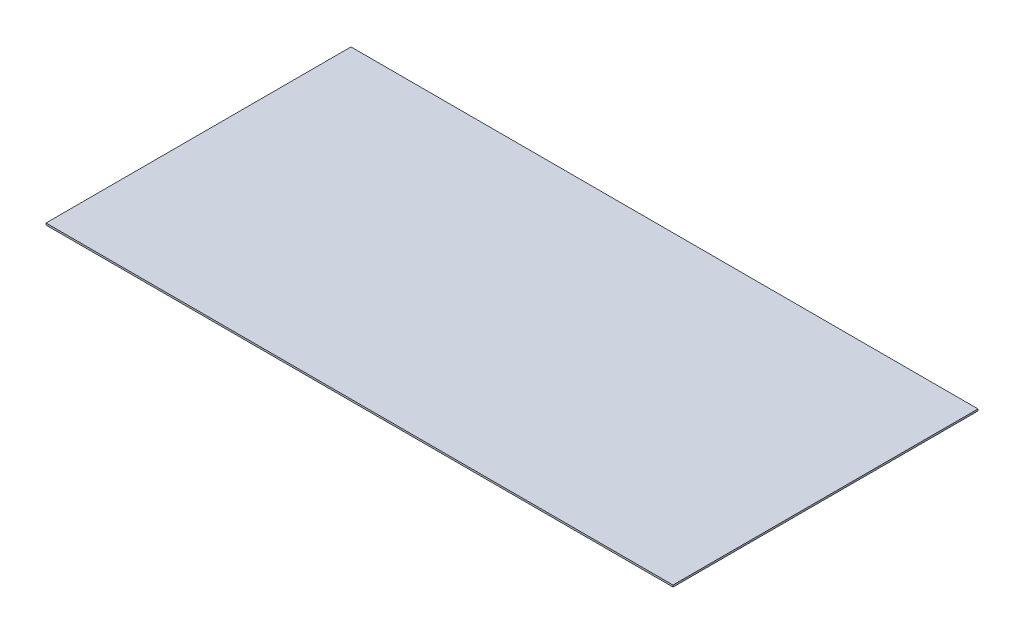
ISO-10303-21;
HEADER;
FILE_DESCRIPTION(('STEP AP214'),'2;1');
FILE_NAME('part.step','',(''),(''),'','','');
FILE_SCHEMA(('AUTOMOTIVE_DESIGN { 1 0 10303 214 1 1 1 1 }'));
ENDSEC;
DATA;
#1=APPLICATION_CONTEXT('core data for automotive mechanical design processes');
#2=APPLICATION_PROTOCOL_DEFINITION('international standard','automotive_design',2000,#1);
#3=PRODUCT_CONTEXT('',#1,'mechanical');
#4=PRODUCT('Part','Part','',(#3));
#5=PRODUCT_RELATED_PRODUCT_CATEGORY('part','',(#4));
#6=PRODUCT_DEFINITION_FORMATION('','',#4);
#7=PRODUCT_DEFINITION_CONTEXT('part definition',#1,'design');
#8=PRODUCT_DEFINITION('design','',#6,#7);
#9=PRODUCT_DEFINITION_SHAPE('','',#8);
#10=(LENGTH_UNIT() NAMED_UNIT(*) SI_UNIT(.MILLI.,.METRE.));
#11=(NAMED_UNIT(*) PLANE_ANGLE_UNIT() SI_UNIT($,.RADIAN.));
#12=(NAMED_UNIT(*) SI_UNIT($,.STERADIAN.) SOLID_ANGLE_UNIT());
#13=UNCERTAINTY_MEASURE_WITH_UNIT(LENGTH_MEASURE(1.E-05),#10,'distance_accuracy_value','');
#14=(GEOMETRIC_REPRESENTATION_CONTEXT(3) GLOBAL_UNCERTAINTY_ASSIGNED_CONTEXT((#13)) GLOBAL_UNIT_ASSIGNED_CONTEXT((#10,
#11,#12)) REPRESENTATION_CONTEXT('',''));
#15=CARTESIAN_POINT('',(0.,0.,0.));
#16=DIRECTION('',(0.,0.,1.));
#17=DIRECTION('',(1.,0.,0.));
#18=AXIS2_PLACEMENT_3D('',#15,#16,#17);
#19=CARTESIAN_POINT('',(0.,3.,0.));
#20=DIRECTION('',(-1.,0.,0.));
#21=DIRECTION('',(0.,0.,1.));
#22=AXIS2_PLACEMENT_3D('',#19,#20,#21);
#23=PLANE('',#22);
#24=DIRECTION('',(0.,0.,-1.));
#25=VECTOR('',#24,1.);
#26=CARTESIAN_POINT('',(0.,0.,0.));
#27=LINE('',#26,#25);
#28=CARTESIAN_POINT('',(0.,0.,500.));
#29=VERTEX_POINT('',#28);
#30=CARTESIAN_POINT('',(0.,0.,0.));
#31=VERTEX_POINT('',#30);
#32=EDGE_CURVE('E96',#29,#31,#27,.T.);
#33=ORIENTED_EDGE('',*,*,#32,.T.);
#34=DIRECTION('',(0.,-1.,0.));
#35=VECTOR('',#34,1.);
#36=CARTESIAN_POINT('',(0.,3.,0.));
#37=LINE('',#36,#35);
#38=CARTESIAN_POINT('',(0.,3.,0.));
#39=VERTEX_POINT('',#38);
#40=EDGE_CURVE('E11',#39,#31,#37,.T.);
#41=ORIENTED_EDGE('',*,*,#40,.F.);
#42=DIRECTION('',(0.,0.,-1.));
#43=VECTOR('',#42,1.);
#44=CARTESIAN_POINT('',(0.,3.,0.));
#45=LINE('',#44,#43);
#46=CARTESIAN_POINT('',(0.,3.,500.));
#47=VERTEX_POINT('',#46);
#48=EDGE_CURVE('E84',#47,#39,#45,.T.);
#49=ORIENTED_EDGE('',*,*,#48,.F.);
#50=DIRECTION('',(0.,-1.,0.));
#51=VECTOR('',#50,1.);
#52=CARTESIAN_POINT('',(0.,3.,500.));
#53=LINE('',#52,#51);
#54=EDGE_CURVE('E92',#47,#29,#53,.T.);
#55=ORIENTED_EDGE('',*,*,#54,.T.);
#56=EDGE_LOOP('',(#33,#41,#49,#55));
#57=FACE_BOUND('',#56,.T.);
#58=ADVANCED_FACE('F33',(#57),#23,.F.);
#59=CARTESIAN_POINT('',(0.,3.,0.));
#60=DIRECTION('',(0.,0.,1.));
#61=DIRECTION('',(1.,0.,0.));
#62=AXIS2_PLACEMENT_3D('',#59,#60,#61);
#63=PLANE('',#62);
#64=DIRECTION('',(-1.,0.,0.));
#65=VECTOR('',#64,1.);
#66=CARTESIAN_POINT('',(0.,0.,0.));
#67=LINE('',#66,#65);
#68=CARTESIAN_POINT('',(-1028.,0.,0.));
#69=VERTEX_POINT('',#68);
#70=EDGE_CURVE('E88',#31,#69,#67,.T.);
#71=ORIENTED_EDGE('',*,*,#70,.T.);
#72=DIRECTION('',(0.,-1.,0.));
#73=VECTOR('',#72,1.);
#74=CARTESIAN_POINT('',(-1028.,3.,0.));
#75=LINE('',#74,#73);
#76=CARTESIAN_POINT('',(-1028.,3.,0.));
#77=VERTEX_POINT('',#76);
#78=EDGE_CURVE('E41',#77,#69,#75,.T.);
#79=ORIENTED_EDGE('',*,*,#78,.F.);
#80=DIRECTION('',(-1.,0.,0.));
#81=VECTOR('',#80,1.);
#82=CARTESIAN_POINT('',(0.,3.,0.));
#83=LINE('',#82,#81);
#84=EDGE_CURVE('E79',#39,#77,#83,.T.);
#85=ORIENTED_EDGE('',*,*,#84,.F.);
#86=ORIENTED_EDGE('',*,*,#40,.T.);
#87=EDGE_LOOP('',(#71,#79,#85,#86));
#88=FACE_BOUND('',#87,.T.);
#89=ADVANCED_FACE('F87',(#88),#63,.F.);
#90=CARTESIAN_POINT('',(-1028.,3.,0.));
#91=DIRECTION('',(1.,0.,0.));
#92=DIRECTION('',(0.,0.,-1.));
#93=AXIS2_PLACEMENT_3D('',#90,#91,#92);
#94=PLANE('',#93);
#95=DIRECTION('',(0.,0.,1.));
#96=VECTOR('',#95,1.);
#97=CARTESIAN_POINT('',(-1028.,0.,0.));
#98=LINE('',#97,#96);
#99=CARTESIAN_POINT('',(-1028.,0.,500.));
#100=VERTEX_POINT('',#99);
#101=EDGE_CURVE('E66',#69,#100,#98,.T.);
#102=ORIENTED_EDGE('',*,*,#101,.T.);
#103=DIRECTION('',(0.,-1.,0.));
#104=VECTOR('',#103,1.);
#105=CARTESIAN_POINT('',(-1028.,3.,500.));
#106=LINE('',#105,#104);
#107=CARTESIAN_POINT('',(-1028.,3.,500.));
#108=VERTEX_POINT('',#107);
#109=EDGE_CURVE('E89',#108,#100,#106,.T.);
#110=ORIENTED_EDGE('',*,*,#109,.F.);
#111=DIRECTION('',(0.,0.,1.));
#112=VECTOR('',#111,1.);
#113=CARTESIAN_POINT('',(-1028.,3.,0.));
#114=LINE('',#113,#112);
#115=EDGE_CURVE('E82',#77,#108,#114,.T.);
#116=ORIENTED_EDGE('',*,*,#115,.F.);
#117=ORIENTED_EDGE('',*,*,#78,.T.);
#118=EDGE_LOOP('',(#102,#110,#116,#117));
#119=FACE_BOUND('',#118,.T.);
#120=ADVANCED_FACE('F90',(#119),#94,.F.);
#121=CARTESIAN_POINT('',(0.,3.,500.));
#122=DIRECTION('',(0.,0.,-1.));
#123=DIRECTION('',(-1.,0.,0.));
#124=AXIS2_PLACEMENT_3D('',#121,#122,#123);
#125=PLANE('',#124);
#126=DIRECTION('',(1.,0.,0.));
#127=VECTOR('',#126,1.);
#128=CARTESIAN_POINT('',(0.,0.,500.));
#129=LINE('',#128,#127);
#130=EDGE_CURVE('E72',#100,#29,#129,.T.);
#131=ORIENTED_EDGE('',*,*,#130,.T.);
#132=ORIENTED_EDGE('',*,*,#54,.F.);
#133=DIRECTION('',(1.,0.,0.));
#134=VECTOR('',#133,1.);
#135=CARTESIAN_POINT('',(0.,3.,500.));
#136=LINE('',#135,#134);
#137=EDGE_CURVE('E49',#108,#47,#136,.T.);
#138=ORIENTED_EDGE('',*,*,#137,.F.);
#139=ORIENTED_EDGE('',*,*,#109,.T.);
#140=EDGE_LOOP('',(#131,#132,#138,#139));
#141=FACE_BOUND('',#140,.T.);
#142=ADVANCED_FACE('F103',(#141),#125,.F.);
#143=CARTESIAN_POINT('',(0.,3.,0.));
#144=DIRECTION('',(0.,-1.,0.));
#145=DIRECTION('',(0.,0.,-1.));
#146=AXIS2_PLACEMENT_3D('',#143,#144,#145);
#147=PLANE('',#146);
#148=ORIENTED_EDGE('',*,*,#48,.T.);
#149=ORIENTED_EDGE('',*,*,#84,.T.);
#150=ORIENTED_EDGE('',*,*,#115,.T.);
#151=ORIENTED_EDGE('',*,*,#137,.T.);
#152=EDGE_LOOP('',(#148,#149,#150,#151));
#153=FACE_BOUND('',#152,.T.);
#154=ADVANCED_FACE('F80',(#153),#147,.F.);
#155=CARTESIAN_POINT('',(0.,0.,0.));
#156=DIRECTION('',(0.,-1.,0.));
#157=DIRECTION('',(0.,0.,-1.));
#158=AXIS2_PLACEMENT_3D('',#155,#156,#157);
#159=PLANE('',#158);
#160=ORIENTED_EDGE('',*,*,#32,.F.);
#161=ORIENTED_EDGE('',*,*,#130,.F.);
#162=ORIENTED_EDGE('',*,*,#101,.F.);
#163=ORIENTED_EDGE('',*,*,#70,.F.);
#164=EDGE_LOOP('',(#160,#161,#162,#163));
#165=FACE_BOUND('',#164,.T.);
#166=ADVANCED_FACE('F106',(#165),#159,.T.);
#167=CLOSED_SHELL('',(#58,#89,#120,#142,#154,#166));
#168=MANIFOLD_SOLID_BREP('B2',#167);
#169=ADVANCED_BREP_SHAPE_REPRESENTATION('',(#18,#168),#14);
#170=SHAPE_DEFINITION_REPRESENTATION(#9,#169);
ENDSEC;
END-ISO-10303-21;
